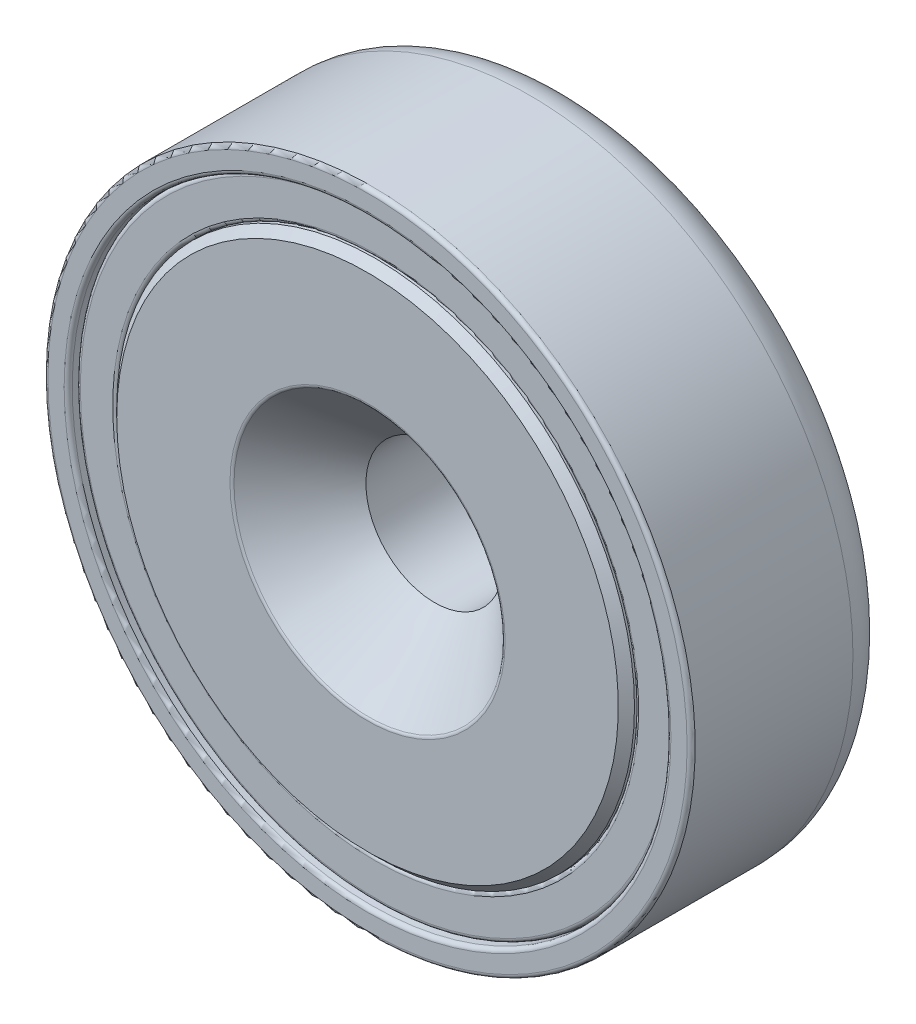
ISO-10303-21;
HEADER;
FILE_DESCRIPTION(('STEP AP214'),'2;1');
FILE_NAME('part.step','',(''),(''),'','','');
FILE_SCHEMA(('AUTOMOTIVE_DESIGN { 1 0 10303 214 1 1 1 1 }'));
ENDSEC;
DATA;
#1=APPLICATION_CONTEXT('core data for automotive mechanical design processes');
#2=APPLICATION_PROTOCOL_DEFINITION('international standard','automotive_design',2000,#1);
#3=PRODUCT_CONTEXT('',#1,'mechanical');
#4=PRODUCT('Part','Part','',(#3));
#5=PRODUCT_RELATED_PRODUCT_CATEGORY('part','',(#4));
#6=PRODUCT_DEFINITION_FORMATION('','',#4);
#7=PRODUCT_DEFINITION_CONTEXT('part definition',#1,'design');
#8=PRODUCT_DEFINITION('design','',#6,#7);
#9=PRODUCT_DEFINITION_SHAPE('','',#8);
#10=(LENGTH_UNIT() NAMED_UNIT(*) SI_UNIT(.MILLI.,.METRE.));
#11=(NAMED_UNIT(*) PLANE_ANGLE_UNIT() SI_UNIT($,.RADIAN.));
#12=(NAMED_UNIT(*) SI_UNIT($,.STERADIAN.) SOLID_ANGLE_UNIT());
#13=UNCERTAINTY_MEASURE_WITH_UNIT(LENGTH_MEASURE(1.E-05),#10,'distance_accuracy_value','');
#14=(GEOMETRIC_REPRESENTATION_CONTEXT(3) GLOBAL_UNCERTAINTY_ASSIGNED_CONTEXT((#13)) GLOBAL_UNIT_ASSIGNED_CONTEXT((#10,
#11,#12)) REPRESENTATION_CONTEXT('',''));
#15=CARTESIAN_POINT('',(0.,0.,0.));
#16=DIRECTION('',(0.,0.,1.));
#17=DIRECTION('',(1.,0.,0.));
#18=AXIS2_PLACEMENT_3D('',#15,#16,#17);
#19=CARTESIAN_POINT('',(0.,0.,1.5));
#20=DIRECTION('',(0.,0.,1.));
#21=DIRECTION('',(1.,0.,0.));
#22=AXIS2_PLACEMENT_3D('',#19,#20,#21);
#23=PLANE('',#22);
#24=CARTESIAN_POINT('',(0.,0.,1.5));
#25=DIRECTION('',(0.,0.,-1.));
#26=DIRECTION('',(0.,1.,0.));
#27=AXIS2_PLACEMENT_3D('',#24,#25,#26);
#28=CIRCLE('',#27,6.50000000000001);
#29=CARTESIAN_POINT('',(0.,6.50000000000001,1.5));
#30=VERTEX_POINT('',#29);
#31=CARTESIAN_POINT('',(0.,-6.50000000000001,1.5));
#32=VERTEX_POINT('',#31);
#33=EDGE_CURVE('P0_E64',#30,#32,#28,.T.);
#34=ORIENTED_EDGE('',*,*,#33,.F.);
#35=CARTESIAN_POINT('',(0.,0.,1.5));
#36=DIRECTION('',(0.,0.,-1.));
#37=DIRECTION('',(0.,-1.,0.));
#38=AXIS2_PLACEMENT_3D('',#35,#36,#37);
#39=CIRCLE('',#38,6.50000000000001);
#40=EDGE_CURVE('P0_E101',#32,#30,#39,.T.);
#41=ORIENTED_EDGE('',*,*,#40,.F.);
#42=EDGE_LOOP('',(#34,#41));
#43=FACE_BOUND('',#42,.T.);
#44=CARTESIAN_POINT('',(0.,0.,1.5));
#45=DIRECTION('',(0.,0.,1.));
#46=DIRECTION('',(0.,1.,0.));
#47=AXIS2_PLACEMENT_3D('',#44,#45,#46);
#48=CIRCLE('',#47,7.3);
#49=CARTESIAN_POINT('',(0.,7.3,1.5));
#50=VERTEX_POINT('',#49);
#51=CARTESIAN_POINT('',(0.,-7.3,1.5));
#52=VERTEX_POINT('',#51);
#53=EDGE_CURVE('P0_E57',#50,#52,#48,.T.);
#54=ORIENTED_EDGE('',*,*,#53,.F.);
#55=CARTESIAN_POINT('',(0.,0.,1.5));
#56=DIRECTION('',(0.,0.,1.));
#57=DIRECTION('',(0.,-1.,0.));
#58=AXIS2_PLACEMENT_3D('',#55,#56,#57);
#59=CIRCLE('',#58,7.3);
#60=EDGE_CURVE('P0_E53',#52,#50,#59,.T.);
#61=ORIENTED_EDGE('',*,*,#60,.F.);
#62=EDGE_LOOP('',(#54,#61));
#63=FACE_BOUND('',#62,.T.);
#64=ADVANCED_FACE('P0_F16',(#43,#63),#23,.F.);
#65=CARTESIAN_POINT('',(0.,0.,1.6));
#66=DIRECTION('',(0.,0.,1.));
#67=DIRECTION('',(0.,-1.,0.));
#68=AXIS2_PLACEMENT_3D('',#65,#66,#67);
#69=TOROIDAL_SURFACE('',#68,7.3,0.0999999999999999);
#70=ORIENTED_EDGE('',*,*,#60,.T.);
#71=ORIENTED_EDGE('',*,*,#53,.T.);
#72=EDGE_LOOP('',(#70,#71));
#73=FACE_BOUND('',#72,.T.);
#74=CARTESIAN_POINT('',(0.,0.,1.6));
#75=DIRECTION('',(0.,0.,-1.));
#76=DIRECTION('',(-1.,0.,0.));
#77=AXIS2_PLACEMENT_3D('',#74,#75,#76);
#78=CIRCLE('',#77,7.4);
#79=CARTESIAN_POINT('',(-7.4,0.,1.6));
#80=VERTEX_POINT('',#79);
#81=EDGE_CURVE('P0_E90',#80,#80,#78,.F.);
#82=ORIENTED_EDGE('',*,*,#81,.F.);
#83=EDGE_LOOP('',(#82));
#84=FACE_BOUND('',#83,.T.);
#85=ADVANCED_FACE('P0_F62',(#73,#84),#69,.T.);
#86=CARTESIAN_POINT('',(0.,0.,1.6));
#87=DIRECTION('',(0.,0.,1.));
#88=DIRECTION('',(0.,-1.,0.));
#89=AXIS2_PLACEMENT_3D('',#86,#87,#88);
#90=TOROIDAL_SURFACE('',#89,6.50000000000001,0.1);
#91=CARTESIAN_POINT('',(0.,0.,1.6));
#92=DIRECTION('',(0.,0.,-1.));
#93=DIRECTION('',(-1.,0.,0.));
#94=AXIS2_PLACEMENT_3D('',#91,#92,#93);
#95=CIRCLE('',#94,6.4);
#96=CARTESIAN_POINT('',(-6.4,0.,1.6));
#97=VERTEX_POINT('',#96);
#98=EDGE_CURVE('P0_E100',#97,#97,#95,.F.);
#99=ORIENTED_EDGE('',*,*,#98,.T.);
#100=EDGE_LOOP('',(#99));
#101=FACE_BOUND('',#100,.T.);
#102=ORIENTED_EDGE('',*,*,#40,.T.);
#103=ORIENTED_EDGE('',*,*,#33,.T.);
#104=EDGE_LOOP('',(#102,#103));
#105=FACE_BOUND('',#104,.T.);
#106=ADVANCED_FACE('P0_F83',(#101,#105),#90,.T.);
#107=CARTESIAN_POINT('',(0.,0.,2.3));
#108=DIRECTION('',(0.,0.,-1.));
#109=DIRECTION('',(-1.,0.,0.));
#110=AXIS2_PLACEMENT_3D('',#107,#108,#109);
#111=CYLINDRICAL_SURFACE('',#110,7.4);
#112=ORIENTED_EDGE('',*,*,#81,.T.);
#113=EDGE_LOOP('',(#112));
#114=FACE_BOUND('',#113,.T.);
#115=CARTESIAN_POINT('',(0.,0.,2.2));
#116=DIRECTION('',(0.,0.,1.));
#117=DIRECTION('',(1.,0.,0.));
#118=AXIS2_PLACEMENT_3D('',#115,#116,#117);
#119=CIRCLE('',#118,7.4);
#120=CARTESIAN_POINT('',(7.4,0.,2.2));
#121=VERTEX_POINT('',#120);
#122=EDGE_CURVE('P0_E103',#121,#121,#119,.T.);
#123=ORIENTED_EDGE('',*,*,#122,.F.);
#124=EDGE_LOOP('',(#123));
#125=FACE_BOUND('',#124,.T.);
#126=ADVANCED_FACE('P0_F247',(#114,#125),#111,.T.);
#127=CARTESIAN_POINT('',(0.,0.,2.3));
#128=DIRECTION('',(0.,0.,-1.));
#129=DIRECTION('',(-1.,0.,0.));
#130=AXIS2_PLACEMENT_3D('',#127,#128,#129);
#131=CYLINDRICAL_SURFACE('',#130,6.4);
#132=CARTESIAN_POINT('',(0.,0.,2.2));
#133=DIRECTION('',(0.,0.,1.));
#134=DIRECTION('',(0.,-1.,0.));
#135=AXIS2_PLACEMENT_3D('',#132,#133,#134);
#136=CIRCLE('',#135,6.4);
#137=CARTESIAN_POINT('',(0.,-6.4,2.2));
#138=VERTEX_POINT('',#137);
#139=EDGE_CURVE('P0_E108',#138,#138,#136,.F.);
#140=ORIENTED_EDGE('',*,*,#139,.F.);
#141=EDGE_LOOP('',(#140));
#142=FACE_BOUND('',#141,.T.);
#143=ORIENTED_EDGE('',*,*,#98,.F.);
#144=EDGE_LOOP('',(#143));
#145=FACE_BOUND('',#144,.T.);
#146=ADVANCED_FACE('P0_F128',(#142,#145),#131,.F.);
#147=CARTESIAN_POINT('',(0.,0.,2.2));
#148=DIRECTION('',(0.,0.,1.));
#149=DIRECTION('',(1.,0.,0.));
#150=AXIS2_PLACEMENT_3D('',#147,#148,#149);
#151=TOROIDAL_SURFACE('',#150,7.3,0.0999999999999981);
#152=CARTESIAN_POINT('',(0.,0.,2.3));
#153=DIRECTION('',(0.,0.,-1.));
#154=DIRECTION('',(1.,0.,0.));
#155=AXIS2_PLACEMENT_3D('',#152,#153,#154);
#156=CIRCLE('',#155,7.3);
#157=CARTESIAN_POINT('',(-7.3,0.,2.3));
#158=VERTEX_POINT('',#157);
#159=CARTESIAN_POINT('',(7.3,0.,2.3));
#160=VERTEX_POINT('',#159);
#161=EDGE_CURVE('P0_E111',#158,#160,#156,.F.);
#162=ORIENTED_EDGE('',*,*,#161,.F.);
#163=CARTESIAN_POINT('',(0.,0.,2.3));
#164=DIRECTION('',(0.,0.,-1.));
#165=DIRECTION('',(-1.,0.,0.));
#166=AXIS2_PLACEMENT_3D('',#163,#164,#165);
#167=CIRCLE('',#166,7.3);
#168=EDGE_CURVE('P0_E178',#160,#158,#167,.F.);
#169=ORIENTED_EDGE('',*,*,#168,.F.);
#170=EDGE_LOOP('',(#162,#169));
#171=FACE_BOUND('',#170,.T.);
#172=ORIENTED_EDGE('',*,*,#122,.T.);
#173=EDGE_LOOP('',(#172));
#174=FACE_BOUND('',#173,.T.);
#175=ADVANCED_FACE('P0_F117',(#171,#174),#151,.T.);
#176=CARTESIAN_POINT('',(0.,0.,2.2));
#177=DIRECTION('',(0.,0.,1.));
#178=DIRECTION('',(0.,-1.,0.));
#179=AXIS2_PLACEMENT_3D('',#176,#177,#178);
#180=TOROIDAL_SURFACE('',#179,6.5,0.0999999999999992);
#181=CARTESIAN_POINT('',(0.,0.,2.3));
#182=DIRECTION('',(0.,0.,1.));
#183=DIRECTION('',(0.,-1.,0.));
#184=AXIS2_PLACEMENT_3D('',#181,#182,#183);
#185=CIRCLE('',#184,6.50000000000001);
#186=CARTESIAN_POINT('',(0.,6.50000000000001,2.3));
#187=VERTEX_POINT('',#186);
#188=CARTESIAN_POINT('',(0.,-6.5,2.3));
#189=VERTEX_POINT('',#188);
#190=EDGE_CURVE('P0_E27',#187,#189,#185,.F.);
#191=ORIENTED_EDGE('',*,*,#190,.F.);
#192=CARTESIAN_POINT('',(0.,0.,2.3));
#193=DIRECTION('',(0.,0.,1.));
#194=DIRECTION('',(0.,1.,0.));
#195=AXIS2_PLACEMENT_3D('',#192,#193,#194);
#196=CIRCLE('',#195,6.50000000000001);
#197=EDGE_CURVE('P0_E11',#189,#187,#196,.F.);
#198=ORIENTED_EDGE('',*,*,#197,.F.);
#199=EDGE_LOOP('',(#191,#198));
#200=FACE_BOUND('',#199,.T.);
#201=ORIENTED_EDGE('',*,*,#139,.T.);
#202=EDGE_LOOP('',(#201));
#203=FACE_BOUND('',#202,.T.);
#204=ADVANCED_FACE('P0_F127',(#200,#203),#180,.T.);
#205=CARTESIAN_POINT('',(0.,0.,2.3));
#206=DIRECTION('',(0.,0.,1.));
#207=DIRECTION('',(1.,0.,0.));
#208=AXIS2_PLACEMENT_3D('',#205,#206,#207);
#209=PLANE('',#208);
#210=ORIENTED_EDGE('',*,*,#190,.T.);
#211=ORIENTED_EDGE('',*,*,#197,.T.);
#212=EDGE_LOOP('',(#210,#211));
#213=FACE_BOUND('',#212,.T.);
#214=ORIENTED_EDGE('',*,*,#161,.T.);
#215=ORIENTED_EDGE('',*,*,#168,.T.);
#216=EDGE_LOOP('',(#214,#215));
#217=FACE_BOUND('',#216,.T.);
#218=ADVANCED_FACE('P0_F149',(#213,#217),#209,.T.);
#219=CLOSED_SHELL('',(#64,#85,#106,#126,#146,#175,#204,#218));
#220=MANIFOLD_SOLID_BREP('P0_B1',#219);
#221=CARTESIAN_POINT('',(0.,0.,1.5));
#222=DIRECTION('',(0.,0.,1.));
#223=DIRECTION('',(1.,0.,0.));
#224=AXIS2_PLACEMENT_3D('',#221,#222,#223);
#225=PLANE('',#224);
#226=CARTESIAN_POINT('',(0.,0.,1.5));
#227=DIRECTION('',(0.,0.,1.));
#228=DIRECTION('',(1.,0.,0.));
#229=AXIS2_PLACEMENT_3D('',#226,#227,#228);
#230=CIRCLE('',#229,7.4);
#231=CARTESIAN_POINT('',(7.4,0.,1.5));
#232=VERTEX_POINT('',#231);
#233=EDGE_CURVE('P1_E236',#232,#232,#230,.T.);
#234=ORIENTED_EDGE('',*,*,#233,.T.);
#235=EDGE_LOOP('',(#234));
#236=FACE_BOUND('',#235,.T.);
#237=CARTESIAN_POINT('',(0.,0.,1.5));
#238=DIRECTION('',(0.,0.,1.));
#239=DIRECTION('',(1.,0.,0.));
#240=AXIS2_PLACEMENT_3D('',#237,#238,#239);
#241=CIRCLE('',#240,6.4);
#242=CARTESIAN_POINT('',(6.4,0.,1.5));
#243=VERTEX_POINT('',#242);
#244=EDGE_CURVE('P1_E233',#243,#243,#241,.T.);
#245=ORIENTED_EDGE('',*,*,#244,.F.);
#246=EDGE_LOOP('',(#245));
#247=FACE_BOUND('',#246,.T.);
#248=ADVANCED_FACE('P1_F16',(#236,#247),#225,.T.);
#249=CARTESIAN_POINT('',(0.,0.,1.5));
#250=DIRECTION('',(0.,0.,1.));
#251=DIRECTION('',(1.,0.,0.));
#252=AXIS2_PLACEMENT_3D('',#249,#250,#251);
#253=CYLINDRICAL_SURFACE('',#252,7.4);
#254=CARTESIAN_POINT('',(0.,0.,2.4));
#255=DIRECTION('',(0.,0.,1.));
#256=DIRECTION('',(0.,-1.,0.));
#257=AXIS2_PLACEMENT_3D('',#254,#255,#256);
#258=CIRCLE('',#257,7.4);
#259=CARTESIAN_POINT('',(0.,-7.4,2.4));
#260=VERTEX_POINT('',#259);
#261=EDGE_CURVE('P1_E235',#260,#260,#258,.F.);
#262=ORIENTED_EDGE('',*,*,#261,.F.);
#263=EDGE_LOOP('',(#262));
#264=FACE_BOUND('',#263,.T.);
#265=ORIENTED_EDGE('',*,*,#233,.F.);
#266=EDGE_LOOP('',(#265));
#267=FACE_BOUND('',#266,.T.);
#268=ADVANCED_FACE('P1_F91',(#264,#267),#253,.F.);
#269=CARTESIAN_POINT('',(0.,0.,1.5));
#270=DIRECTION('',(0.,0.,1.));
#271=DIRECTION('',(1.,0.,0.));
#272=AXIS2_PLACEMENT_3D('',#269,#270,#271);
#273=CYLINDRICAL_SURFACE('',#272,6.4);
#274=CARTESIAN_POINT('',(0.,0.,2.30000000004793));
#275=DIRECTION('',(0.,0.,-1.));
#276=DIRECTION('',(-1.,0.,0.));
#277=AXIS2_PLACEMENT_3D('',#274,#275,#276);
#278=CIRCLE('',#277,6.39999999998508);
#279=CARTESIAN_POINT('',(-6.39999999998508,0.,2.30000000004793));
#280=VERTEX_POINT('',#279);
#281=EDGE_CURVE('P1_E62',#280,#280,#278,.F.);
#282=ORIENTED_EDGE('',*,*,#281,.F.);
#283=EDGE_LOOP('',(#282));
#284=FACE_BOUND('',#283,.T.);
#285=ORIENTED_EDGE('',*,*,#244,.T.);
#286=EDGE_LOOP('',(#285));
#287=FACE_BOUND('',#286,.T.);
#288=ADVANCED_FACE('P1_F86',(#284,#287),#273,.T.);
#289=CARTESIAN_POINT('',(0.,0.,2.4));
#290=DIRECTION('',(0.,0.,1.));
#291=DIRECTION('',(0.,-1.,0.));
#292=AXIS2_PLACEMENT_3D('',#289,#290,#291);
#293=TOROIDAL_SURFACE('',#292,7.50000000000001,0.1);
#294=ORIENTED_EDGE('',*,*,#261,.T.);
#295=EDGE_LOOP('',(#294));
#296=FACE_BOUND('',#295,.T.);
#297=CARTESIAN_POINT('',(0.,0.,2.5));
#298=DIRECTION('',(0.,0.,1.));
#299=DIRECTION('',(0.,-1.,0.));
#300=AXIS2_PLACEMENT_3D('',#297,#298,#299);
#301=CIRCLE('',#300,7.50000000000001);
#302=CARTESIAN_POINT('',(0.,7.50000000000001,2.5));
#303=VERTEX_POINT('',#302);
#304=CARTESIAN_POINT('',(0.,-7.5,2.5));
#305=VERTEX_POINT('',#304);
#306=EDGE_CURVE('P1_E55',#303,#305,#301,.F.);
#307=ORIENTED_EDGE('',*,*,#306,.F.);
#308=CARTESIAN_POINT('',(0.,0.,2.5));
#309=DIRECTION('',(0.,0.,1.));
#310=DIRECTION('',(0.,1.,0.));
#311=AXIS2_PLACEMENT_3D('',#308,#309,#310);
#312=CIRCLE('',#311,7.50000000000001);
#313=EDGE_CURVE('P1_E58',#305,#303,#312,.F.);
#314=ORIENTED_EDGE('',*,*,#313,.F.);
#315=EDGE_LOOP('',(#307,#314));
#316=FACE_BOUND('',#315,.T.);
#317=ADVANCED_FACE('P1_F66',(#296,#316),#293,.T.);
#318=CARTESIAN_POINT('',(0.,0.,2.30000000016162));
#319=DIRECTION('',(0.,0.,-1.));
#320=DIRECTION('',(-1.,0.,0.));
#321=AXIS2_PLACEMENT_3D('',#318,#319,#320);
#322=CONICAL_SURFACE('',#321,6.3999999998714,0.785398163397448);
#323=ORIENTED_EDGE('',*,*,#281,.T.);
#324=EDGE_LOOP('',(#323));
#325=FACE_BOUND('',#324,.T.);
#326=CARTESIAN_POINT('',(0.,0.,2.50000000016826));
#327=DIRECTION('',(0.,0.,-1.));
#328=DIRECTION('',(-1.,0.,0.));
#329=AXIS2_PLACEMENT_3D('',#326,#327,#328);
#330=CIRCLE('',#329,6.19999999986476);
#331=CARTESIAN_POINT('',(-6.19999999986476,0.,2.50000000016826));
#332=VERTEX_POINT('',#331);
#333=EDGE_CURVE('P1_E67',#332,#332,#330,.F.);
#334=ORIENTED_EDGE('',*,*,#333,.F.);
#335=EDGE_LOOP('',(#334));
#336=FACE_BOUND('',#335,.T.);
#337=ADVANCED_FACE('P1_F85',(#325,#336),#322,.T.);
#338=CARTESIAN_POINT('',(0.,0.,2.5));
#339=DIRECTION('',(0.,0.,1.));
#340=DIRECTION('',(1.,0.,0.));
#341=AXIS2_PLACEMENT_3D('',#338,#339,#340);
#342=PLANE('',#341);
#343=CARTESIAN_POINT('',(0.,0.,2.5));
#344=DIRECTION('',(0.,0.,-1.));
#345=DIRECTION('',(1.,0.,0.));
#346=AXIS2_PLACEMENT_3D('',#343,#344,#345);
#347=CIRCLE('',#346,7.9);
#348=CARTESIAN_POINT('',(7.9,0.,2.5));
#349=VERTEX_POINT('',#348);
#350=CARTESIAN_POINT('',(-7.9,0.,2.5));
#351=VERTEX_POINT('',#350);
#352=EDGE_CURVE('P1_E223',#349,#351,#347,.T.);
#353=ORIENTED_EDGE('',*,*,#352,.F.);
#354=CARTESIAN_POINT('',(0.,0.,2.5));
#355=DIRECTION('',(0.,0.,-1.));
#356=DIRECTION('',(-1.,0.,0.));
#357=AXIS2_PLACEMENT_3D('',#354,#355,#356);
#358=CIRCLE('',#357,7.9);
#359=EDGE_CURVE('P1_E222',#351,#349,#358,.T.);
#360=ORIENTED_EDGE('',*,*,#359,.F.);
#361=EDGE_LOOP('',(#353,#360));
#362=FACE_BOUND('',#361,.T.);
#363=ORIENTED_EDGE('',*,*,#313,.T.);
#364=ORIENTED_EDGE('',*,*,#306,.T.);
#365=EDGE_LOOP('',(#363,#364));
#366=FACE_BOUND('',#365,.T.);
#367=ADVANCED_FACE('P1_F60',(#362,#366),#342,.T.);
#368=CARTESIAN_POINT('',(0.,0.,2.5));
#369=DIRECTION('',(0.,0.,1.));
#370=DIRECTION('',(1.,0.,0.));
#371=AXIS2_PLACEMENT_3D('',#368,#369,#370);
#372=PLANE('',#371);
#373=CARTESIAN_POINT('',(0.,0.,2.5));
#374=DIRECTION('',(0.,0.,1.));
#375=DIRECTION('',(1.,0.,0.));
#376=AXIS2_PLACEMENT_3D('',#373,#374,#375);
#377=CIRCLE('',#376,3.40142135623731);
#378=CARTESIAN_POINT('',(3.40142135623731,0.,2.5));
#379=VERTEX_POINT('',#378);
#380=CARTESIAN_POINT('',(-3.40142135623731,0.,2.5));
#381=VERTEX_POINT('',#380);
#382=EDGE_CURVE('P1_E157',#379,#381,#377,.T.);
#383=ORIENTED_EDGE('',*,*,#382,.F.);
#384=CARTESIAN_POINT('',(0.,0.,2.5));
#385=DIRECTION('',(0.,0.,1.));
#386=DIRECTION('',(-1.,0.,0.));
#387=AXIS2_PLACEMENT_3D('',#384,#385,#386);
#388=CIRCLE('',#387,3.40142135623731);
#389=EDGE_CURVE('P1_E187',#381,#379,#388,.T.);
#390=ORIENTED_EDGE('',*,*,#389,.F.);
#391=EDGE_LOOP('',(#383,#390));
#392=FACE_BOUND('',#391,.T.);
#393=ORIENTED_EDGE('',*,*,#333,.T.);
#394=EDGE_LOOP('',(#393));
#395=FACE_BOUND('',#394,.T.);
#396=ADVANCED_FACE('P1_F196',(#392,#395),#372,.T.);
#397=CARTESIAN_POINT('',(0.,0.,2.4));
#398=DIRECTION('',(0.,0.,1.));
#399=DIRECTION('',(1.,0.,0.));
#400=AXIS2_PLACEMENT_3D('',#397,#398,#399);
#401=TOROIDAL_SURFACE('',#400,7.9,0.0999999999999996);
#402=ORIENTED_EDGE('',*,*,#352,.T.);
#403=ORIENTED_EDGE('',*,*,#359,.T.);
#404=EDGE_LOOP('',(#402,#403));
#405=FACE_BOUND('',#404,.T.);
#406=CARTESIAN_POINT('',(0.,0.,2.4));
#407=DIRECTION('',(0.,0.,-1.));
#408=DIRECTION('',(-1.,0.,0.));
#409=AXIS2_PLACEMENT_3D('',#406,#407,#408);
#410=CIRCLE('',#409,8.);
#411=CARTESIAN_POINT('',(-8.,0.,2.4));
#412=VERTEX_POINT('',#411);
#413=EDGE_CURVE('P1_E185',#412,#412,#410,.T.);
#414=ORIENTED_EDGE('',*,*,#413,.F.);
#415=EDGE_LOOP('',(#414));
#416=FACE_BOUND('',#415,.T.);
#417=ADVANCED_FACE('P1_F175',(#405,#416),#401,.T.);
#418=CARTESIAN_POINT('',(0.,0.,2.4));
#419=DIRECTION('',(0.,0.,1.));
#420=DIRECTION('',(1.,0.,0.));
#421=AXIS2_PLACEMENT_3D('',#418,#419,#420);
#422=TOROIDAL_SURFACE('',#421,3.40142135623731,0.1);
#423=ORIENTED_EDGE('',*,*,#382,.T.);
#424=ORIENTED_EDGE('',*,*,#389,.T.);
#425=EDGE_LOOP('',(#423,#424));
#426=FACE_BOUND('',#425,.T.);
#427=CARTESIAN_POINT('',(0.,0.,2.47071067803972));
#428=DIRECTION('',(0.,0.,1.));
#429=DIRECTION('',(1.,0.,0.));
#430=AXIS2_PLACEMENT_3D('',#427,#428,#429);
#431=CIRCLE('',#430,3.33071067802848);
#432=CARTESIAN_POINT('',(3.33071067802848,0.,2.47071067803972));
#433=VERTEX_POINT('',#432);
#434=EDGE_CURVE('P1_E183',#433,#433,#431,.F.);
#435=ORIENTED_EDGE('',*,*,#434,.T.);
#436=EDGE_LOOP('',(#435));
#437=FACE_BOUND('',#436,.T.);
#438=ADVANCED_FACE('P1_F164',(#426,#437),#422,.T.);
#439=CARTESIAN_POINT('',(0.,0.,2.5));
#440=DIRECTION('',(0.,0.,-1.));
#441=DIRECTION('',(-1.,0.,0.));
#442=AXIS2_PLACEMENT_3D('',#439,#440,#441);
#443=CYLINDRICAL_SURFACE('',#442,8.);
#444=CARTESIAN_POINT('',(0.,0.,-1.50000000000001));
#445=DIRECTION('',(0.,0.,1.));
#446=DIRECTION('',(1.,0.,0.));
#447=AXIS2_PLACEMENT_3D('',#444,#445,#446);
#448=CIRCLE('',#447,7.99999999999999);
#449=CARTESIAN_POINT('',(7.99999999999999,0.,-1.50000000000001));
#450=VERTEX_POINT('',#449);
#451=EDGE_CURVE('P1_E389',#450,#450,#448,.F.);
#452=ORIENTED_EDGE('',*,*,#451,.F.);
#453=EDGE_LOOP('',(#452));
#454=FACE_BOUND('',#453,.T.);
#455=ORIENTED_EDGE('',*,*,#413,.T.);
#456=EDGE_LOOP('',(#455));
#457=FACE_BOUND('',#456,.T.);
#458=ADVANCED_FACE('P1_F174',(#454,#457),#443,.T.);
#459=CARTESIAN_POINT('',(0.,0.,2.47071067798288));
#460=DIRECTION('',(0.,0.,1.));
#461=DIRECTION('',(1.,0.,0.));
#462=AXIS2_PLACEMENT_3D('',#459,#460,#461);
#463=CONICAL_SURFACE('',#462,3.33071067797164,0.785398163397448);
#464=ORIENTED_EDGE('',*,*,#434,.F.);
#465=EDGE_LOOP('',(#464));
#466=FACE_BOUND('',#465,.T.);
#467=CARTESIAN_POINT('',(0.,0.,0.839999999999999));
#468=DIRECTION('',(0.,0.,1.));
#469=DIRECTION('',(1.,0.,0.));
#470=AXIS2_PLACEMENT_3D('',#467,#468,#469);
#471=CIRCLE('',#470,1.7);
#472=CARTESIAN_POINT('',(1.7,0.,0.839999999999999));
#473=VERTEX_POINT('',#472);
#474=EDGE_CURVE('P1_E387',#473,#473,#471,.F.);
#475=ORIENTED_EDGE('',*,*,#474,.T.);
#476=EDGE_LOOP('',(#475));
#477=FACE_BOUND('',#476,.T.);
#478=ADVANCED_FACE('P1_F136',(#466,#477),#463,.F.);
#479=CARTESIAN_POINT('',(0.,0.,-1.50000000000001));
#480=DIRECTION('',(0.,0.,1.));
#481=DIRECTION('',(1.,0.,0.));
#482=AXIS2_PLACEMENT_3D('',#479,#480,#481);
#483=TOROIDAL_SURFACE('',#482,7.,0.999999999999997);
#484=ORIENTED_EDGE('',*,*,#451,.T.);
#485=EDGE_LOOP('',(#484));
#486=FACE_BOUND('',#485,.T.);
#487=CARTESIAN_POINT('',(0.,0.,-2.5));
#488=DIRECTION('',(0.,0.,1.));
#489=DIRECTION('',(1.,0.,0.));
#490=AXIS2_PLACEMENT_3D('',#487,#488,#489);
#491=CIRCLE('',#490,7.);
#492=CARTESIAN_POINT('',(7.,0.,-2.5));
#493=VERTEX_POINT('',#492);
#494=CARTESIAN_POINT('',(-7.,0.,-2.5));
#495=VERTEX_POINT('',#494);
#496=EDGE_CURVE('P1_E27',#493,#495,#491,.T.);
#497=ORIENTED_EDGE('',*,*,#496,.T.);
#498=CARTESIAN_POINT('',(0.,0.,-2.5));
#499=DIRECTION('',(0.,0.,1.));
#500=DIRECTION('',(-1.,0.,0.));
#501=AXIS2_PLACEMENT_3D('',#498,#499,#500);
#502=CIRCLE('',#501,7.);
#503=EDGE_CURVE('P1_E388',#495,#493,#502,.T.);
#504=ORIENTED_EDGE('',*,*,#503,.T.);
#505=EDGE_LOOP('',(#497,#504));
#506=FACE_BOUND('',#505,.T.);
#507=ADVANCED_FACE('P1_F110',(#486,#506),#483,.T.);
#508=CARTESIAN_POINT('',(0.,0.,2.5));
#509=DIRECTION('',(0.,0.,1.));
#510=DIRECTION('',(1.,0.,0.));
#511=AXIS2_PLACEMENT_3D('',#508,#509,#510);
#512=CYLINDRICAL_SURFACE('',#511,1.7);
#513=ORIENTED_EDGE('',*,*,#474,.F.);
#514=EDGE_LOOP('',(#513));
#515=FACE_BOUND('',#514,.T.);
#516=CARTESIAN_POINT('',(0.,0.,-2.5));
#517=DIRECTION('',(0.,0.,1.));
#518=DIRECTION('',(1.,0.,0.));
#519=AXIS2_PLACEMENT_3D('',#516,#517,#518);
#520=CIRCLE('',#519,1.7);
#521=CARTESIAN_POINT('',(1.7,0.,-2.5));
#522=VERTEX_POINT('',#521);
#523=EDGE_CURVE('P1_E11',#522,#522,#520,.F.);
#524=ORIENTED_EDGE('',*,*,#523,.T.);
#525=EDGE_LOOP('',(#524));
#526=FACE_BOUND('',#525,.T.);
#527=ADVANCED_FACE('P1_F104',(#515,#526),#512,.F.);
#528=CARTESIAN_POINT('',(0.,0.,-2.5));
#529=DIRECTION('',(0.,0.,1.));
#530=DIRECTION('',(1.,0.,0.));
#531=AXIS2_PLACEMENT_3D('',#528,#529,#530);
#532=PLANE('',#531);
#533=ORIENTED_EDGE('',*,*,#523,.F.);
#534=EDGE_LOOP('',(#533));
#535=FACE_BOUND('',#534,.T.);
#536=ORIENTED_EDGE('',*,*,#503,.F.);
#537=ORIENTED_EDGE('',*,*,#496,.F.);
#538=EDGE_LOOP('',(#536,#537));
#539=FACE_BOUND('',#538,.T.);
#540=ADVANCED_FACE('P1_F102',(#535,#539),#532,.F.);
#541=CLOSED_SHELL('',(#248,#268,#288,#317,#337,#367,#396,#417,#438,#458,#478,#507,#527,#540));
#542=MANIFOLD_SOLID_BREP('P1_B1',#541);
#543=ADVANCED_BREP_SHAPE_REPRESENTATION('',(#18,#220,#542),#14);
#544=SHAPE_DEFINITION_REPRESENTATION(#9,#543);
ENDSEC;
END-ISO-10303-21;
